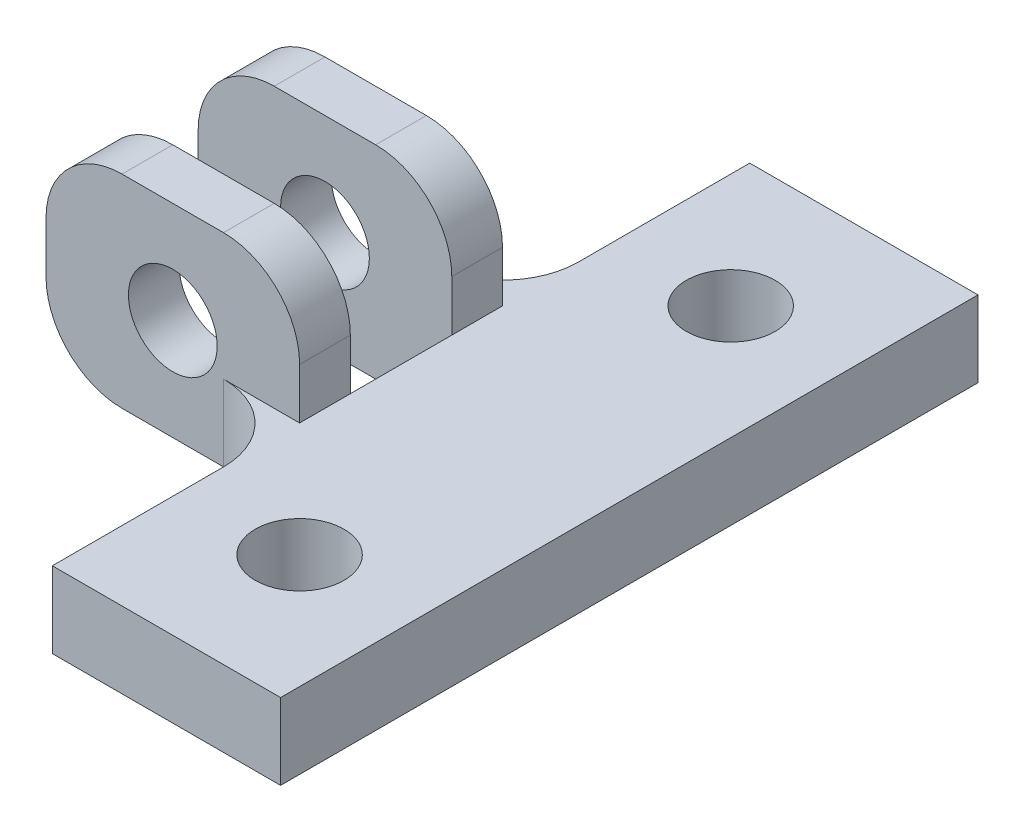
ISO-10303-21;
HEADER;
FILE_DESCRIPTION(('STEP AP214'),'2;1');
FILE_NAME('part.step','',(''),(''),'','','');
FILE_SCHEMA(('AUTOMOTIVE_DESIGN { 1 0 10303 214 1 1 1 1 }'));
ENDSEC;
DATA;
#1=APPLICATION_CONTEXT('core data for automotive mechanical design processes');
#2=APPLICATION_PROTOCOL_DEFINITION('international standard','automotive_design',2000,#1);
#3=PRODUCT_CONTEXT('',#1,'mechanical');
#4=PRODUCT('Part','Part','',(#3));
#5=PRODUCT_RELATED_PRODUCT_CATEGORY('part','',(#4));
#6=PRODUCT_DEFINITION_FORMATION('','',#4);
#7=PRODUCT_DEFINITION_CONTEXT('part definition',#1,'design');
#8=PRODUCT_DEFINITION('design','',#6,#7);
#9=PRODUCT_DEFINITION_SHAPE('','',#8);
#10=(LENGTH_UNIT() NAMED_UNIT(*) SI_UNIT(.MILLI.,.METRE.));
#11=(NAMED_UNIT(*) PLANE_ANGLE_UNIT() SI_UNIT($,.RADIAN.));
#12=(NAMED_UNIT(*) SI_UNIT($,.STERADIAN.) SOLID_ANGLE_UNIT());
#13=UNCERTAINTY_MEASURE_WITH_UNIT(LENGTH_MEASURE(1.E-05),#10,'distance_accuracy_value','');
#14=(GEOMETRIC_REPRESENTATION_CONTEXT(3) GLOBAL_UNCERTAINTY_ASSIGNED_CONTEXT((#13)) GLOBAL_UNIT_ASSIGNED_CONTEXT((#10,
#11,#12)) REPRESENTATION_CONTEXT('',''));
#15=CARTESIAN_POINT('',(0.,0.,0.));
#16=DIRECTION('',(0.,0.,1.));
#17=DIRECTION('',(1.,0.,0.));
#18=AXIS2_PLACEMENT_3D('',#15,#16,#17);
#19=CARTESIAN_POINT('',(-24.,3.,-13.75));
#20=DIRECTION('',(1.,0.,0.));
#21=DIRECTION('',(0.,0.,-1.));
#22=AXIS2_PLACEMENT_3D('',#19,#20,#21);
#23=PLANE('',#22);
#24=DIRECTION('',(0.,1.,0.));
#25=VECTOR('',#24,1.);
#26=CARTESIAN_POINT('',(-24.,3.,-2.));
#27=LINE('',#26,#25);
#28=CARTESIAN_POINT('',(-24.,0.,-2.));
#29=VERTEX_POINT('',#28);
#30=CARTESIAN_POINT('',(-24.,3.,-2.));
#31=VERTEX_POINT('',#30);
#32=EDGE_CURVE('E215',#29,#31,#27,.T.);
#33=ORIENTED_EDGE('',*,*,#32,.F.);
#34=DIRECTION('',(0.,0.,1.));
#35=VECTOR('',#34,1.);
#36=CARTESIAN_POINT('',(-24.,0.,-13.75));
#37=LINE('',#36,#35);
#38=CARTESIAN_POINT('',(-24.,0.,2.));
#39=VERTEX_POINT('',#38);
#40=EDGE_CURVE('E275',#29,#39,#37,.T.);
#41=ORIENTED_EDGE('',*,*,#40,.T.);
#42=DIRECTION('',(0.,-1.,0.));
#43=VECTOR('',#42,1.);
#44=CARTESIAN_POINT('',(-24.,3.,2.));
#45=LINE('',#44,#43);
#46=CARTESIAN_POINT('',(-24.,3.,2.));
#47=VERTEX_POINT('',#46);
#48=EDGE_CURVE('E217',#47,#39,#45,.T.);
#49=ORIENTED_EDGE('',*,*,#48,.F.);
#50=DIRECTION('',(0.,0.,1.));
#51=VECTOR('',#50,1.);
#52=CARTESIAN_POINT('',(-24.,3.,-13.75));
#53=LINE('',#52,#51);
#54=EDGE_CURVE('E208',#31,#47,#53,.T.);
#55=ORIENTED_EDGE('',*,*,#54,.F.);
#56=EDGE_LOOP('',(#33,#41,#49,#55));
#57=FACE_BOUND('',#56,.T.);
#58=ADVANCED_FACE('F35',(#57),#23,.F.);
#59=CARTESIAN_POINT('',(-24.,0.,-13.75));
#60=VERTEX_POINT('',#59);
#61=CARTESIAN_POINT('',(-24.,0.,-7.));
#62=VERTEX_POINT('',#61);
#63=EDGE_CURVE('E272',#60,#62,#37,.T.);
#64=ORIENTED_EDGE('',*,*,#63,.T.);
#65=DIRECTION('',(0.,-1.,0.));
#66=VECTOR('',#65,1.);
#67=CARTESIAN_POINT('',(-24.,3.,-7.));
#68=LINE('',#67,#66);
#69=CARTESIAN_POINT('',(-24.,3.,-7.));
#70=VERTEX_POINT('',#69);
#71=EDGE_CURVE('E57',#62,#70,#68,.F.);
#72=ORIENTED_EDGE('',*,*,#71,.T.);
#73=CARTESIAN_POINT('',(-24.,3.,-13.75));
#74=VERTEX_POINT('',#73);
#75=EDGE_CURVE('E218',#74,#70,#53,.T.);
#76=ORIENTED_EDGE('',*,*,#75,.F.);
#77=DIRECTION('',(0.,-1.,0.));
#78=VECTOR('',#77,1.);
#79=CARTESIAN_POINT('',(-24.,3.,-13.75));
#80=LINE('',#79,#78);
#81=EDGE_CURVE('E271',#74,#60,#80,.T.);
#82=ORIENTED_EDGE('',*,*,#81,.T.);
#83=EDGE_LOOP('',(#64,#72,#76,#82));
#84=FACE_BOUND('',#83,.T.);
#85=ADVANCED_FACE('F371',(#84),#23,.F.);
#86=CARTESIAN_POINT('',(-24.,3.,7.));
#87=VERTEX_POINT('',#86);
#88=CARTESIAN_POINT('',(-24.,3.,13.75));
#89=VERTEX_POINT('',#88);
#90=EDGE_CURVE('E219',#87,#89,#53,.T.);
#91=ORIENTED_EDGE('',*,*,#90,.F.);
#92=DIRECTION('',(0.,1.,0.));
#93=VECTOR('',#92,1.);
#94=CARTESIAN_POINT('',(-24.,0.,7.));
#95=LINE('',#94,#93);
#96=CARTESIAN_POINT('',(-24.,0.,7.));
#97=VERTEX_POINT('',#96);
#98=EDGE_CURVE('E357',#87,#97,#95,.F.);
#99=ORIENTED_EDGE('',*,*,#98,.T.);
#100=CARTESIAN_POINT('',(-24.,0.,13.75));
#101=VERTEX_POINT('',#100);
#102=EDGE_CURVE('E262',#97,#101,#37,.T.);
#103=ORIENTED_EDGE('',*,*,#102,.T.);
#104=DIRECTION('',(0.,-1.,0.));
#105=VECTOR('',#104,1.);
#106=CARTESIAN_POINT('',(-24.,3.,13.75));
#107=LINE('',#106,#105);
#108=EDGE_CURVE('E289',#89,#101,#107,.T.);
#109=ORIENTED_EDGE('',*,*,#108,.F.);
#110=EDGE_LOOP('',(#91,#99,#103,#109));
#111=FACE_BOUND('',#110,.T.);
#112=ADVANCED_FACE('F413',(#111),#23,.F.);
#113=CARTESIAN_POINT('',(0.,3.,0.));
#114=DIRECTION('',(0.,1.,0.));
#115=DIRECTION('',(0.,0.,1.));
#116=AXIS2_PLACEMENT_3D('',#113,#114,#115);
#117=PLANE('',#116);
#118=DIRECTION('',(0.,0.,-1.));
#119=VECTOR('',#118,1.);
#120=CARTESIAN_POINT('',(-24.,3.,0.));
#121=LINE('',#120,#119);
#122=CARTESIAN_POINT('',(-24.,3.,-4.));
#123=VERTEX_POINT('',#122);
#124=EDGE_CURVE('E196',#31,#123,#121,.T.);
#125=ORIENTED_EDGE('',*,*,#124,.F.);
#126=ORIENTED_EDGE('',*,*,#54,.T.);
#127=DIRECTION('',(0.,0.,-1.));
#128=VECTOR('',#127,1.);
#129=CARTESIAN_POINT('',(-24.,3.,0.));
#130=LINE('',#129,#128);
#131=CARTESIAN_POINT('',(-24.,3.,4.));
#132=VERTEX_POINT('',#131);
#133=EDGE_CURVE('E226',#132,#47,#130,.T.);
#134=ORIENTED_EDGE('',*,*,#133,.F.);
#135=DIRECTION('',(1.,0.,0.));
#136=VECTOR('',#135,1.);
#137=CARTESIAN_POINT('',(-34.,3.,4.));
#138=LINE('',#137,#136);
#139=CARTESIAN_POINT('',(-27.,3.,4.));
#140=VERTEX_POINT('',#139);
#141=EDGE_CURVE('E299',#140,#132,#138,.T.);
#142=ORIENTED_EDGE('',*,*,#141,.F.);
#143=CARTESIAN_POINT('',(-27.,3.,7.));
#144=DIRECTION('',(0.,1.,0.));
#145=DIRECTION('',(0.,0.,1.));
#146=AXIS2_PLACEMENT_3D('',#143,#144,#145);
#147=CIRCLE('',#146,3.);
#148=EDGE_CURVE('E360',#140,#87,#147,.F.);
#149=ORIENTED_EDGE('',*,*,#148,.T.);
#150=ORIENTED_EDGE('',*,*,#90,.T.);
#151=DIRECTION('',(1.,0.,0.));
#152=VECTOR('',#151,1.);
#153=CARTESIAN_POINT('',(-24.,3.,13.75));
#154=LINE('',#153,#152);
#155=CARTESIAN_POINT('',(-15.,3.,13.75));
#156=VERTEX_POINT('',#155);
#157=EDGE_CURVE('E265',#89,#156,#154,.T.);
#158=ORIENTED_EDGE('',*,*,#157,.T.);
#159=DIRECTION('',(0.,0.,-1.));
#160=VECTOR('',#159,1.);
#161=CARTESIAN_POINT('',(-15.,3.,-13.75));
#162=LINE('',#161,#160);
#163=CARTESIAN_POINT('',(-15.,3.,-13.75));
#164=VERTEX_POINT('',#163);
#165=EDGE_CURVE('E267',#156,#164,#162,.T.);
#166=ORIENTED_EDGE('',*,*,#165,.T.);
#167=DIRECTION('',(-1.,0.,0.));
#168=VECTOR('',#167,1.);
#169=CARTESIAN_POINT('',(-24.,3.,-13.75));
#170=LINE('',#169,#168);
#171=EDGE_CURVE('E269',#164,#74,#170,.T.);
#172=ORIENTED_EDGE('',*,*,#171,.T.);
#173=ORIENTED_EDGE('',*,*,#75,.T.);
#174=CARTESIAN_POINT('',(-27.,3.,-7.));
#175=DIRECTION('',(0.,1.,0.));
#176=DIRECTION('',(0.,0.,1.));
#177=AXIS2_PLACEMENT_3D('',#174,#175,#176);
#178=CIRCLE('',#177,3.);
#179=CARTESIAN_POINT('',(-27.,3.,-4.));
#180=VERTEX_POINT('',#179);
#181=EDGE_CURVE('E11',#70,#180,#178,.F.);
#182=ORIENTED_EDGE('',*,*,#181,.T.);
#183=DIRECTION('',(-1.,0.,0.));
#184=VECTOR('',#183,1.);
#185=CARTESIAN_POINT('',(-34.,3.,-4.));
#186=LINE('',#185,#184);
#187=EDGE_CURVE('E49',#123,#180,#186,.T.);
#188=ORIENTED_EDGE('',*,*,#187,.F.);
#189=EDGE_LOOP('',(#125,#126,#134,#142,#149,#150,#158,#166,#172,#173,#182,#188));
#190=FACE_BOUND('',#189,.T.);
#191=CARTESIAN_POINT('',(-19.5,3.,-8.5));
#192=DIRECTION('',(0.,1.,0.));
#193=DIRECTION('',(0.,0.,1.));
#194=AXIS2_PLACEMENT_3D('',#191,#192,#193);
#195=CIRCLE('',#194,1.75);
#196=CARTESIAN_POINT('',(-19.5,3.,-6.75));
#197=VERTEX_POINT('',#196);
#198=EDGE_CURVE('E259',#197,#197,#195,.T.);
#199=ORIENTED_EDGE('',*,*,#198,.F.);
#200=EDGE_LOOP('',(#199));
#201=FACE_BOUND('',#200,.T.);
#202=CARTESIAN_POINT('',(-19.5,3.,8.5));
#203=DIRECTION('',(0.,1.,0.));
#204=DIRECTION('',(0.,0.,1.));
#205=AXIS2_PLACEMENT_3D('',#202,#203,#204);
#206=CIRCLE('',#205,1.75);
#207=CARTESIAN_POINT('',(-19.5,3.,10.25));
#208=VERTEX_POINT('',#207);
#209=EDGE_CURVE('E253',#208,#208,#206,.T.);
#210=ORIENTED_EDGE('',*,*,#209,.F.);
#211=EDGE_LOOP('',(#210));
#212=FACE_BOUND('',#211,.T.);
#213=ADVANCED_FACE('F205',(#190,#201,#212),#117,.T.);
#214=CARTESIAN_POINT('',(0.,0.,0.));
#215=DIRECTION('',(0.,1.,0.));
#216=DIRECTION('',(0.,0.,1.));
#217=AXIS2_PLACEMENT_3D('',#214,#215,#216);
#218=PLANE('',#217);
#219=DIRECTION('',(1.,0.,0.));
#220=VECTOR('',#219,1.);
#221=CARTESIAN_POINT('',(-34.,0.,-2.));
#222=LINE('',#221,#220);
#223=CARTESIAN_POINT('',(-31.,0.,-2.));
#224=VERTEX_POINT('',#223);
#225=EDGE_CURVE('E223',#224,#29,#222,.T.);
#226=ORIENTED_EDGE('',*,*,#225,.F.);
#227=DIRECTION('',(0.,0.,1.));
#228=VECTOR('',#227,1.);
#229=CARTESIAN_POINT('',(-31.,0.,0.));
#230=LINE('',#229,#228);
#231=CARTESIAN_POINT('',(-31.,0.,-4.));
#232=VERTEX_POINT('',#231);
#233=EDGE_CURVE('E355',#224,#232,#230,.F.);
#234=ORIENTED_EDGE('',*,*,#233,.T.);
#235=DIRECTION('',(1.,0.,0.));
#236=VECTOR('',#235,1.);
#237=CARTESIAN_POINT('',(-34.,0.,-4.));
#238=LINE('',#237,#236);
#239=CARTESIAN_POINT('',(-27.,0.,-4.));
#240=VERTEX_POINT('',#239);
#241=EDGE_CURVE('E237',#232,#240,#238,.T.);
#242=ORIENTED_EDGE('',*,*,#241,.T.);
#243=CARTESIAN_POINT('',(-27.,0.,-7.));
#244=DIRECTION('',(0.,1.,0.));
#245=DIRECTION('',(0.,0.,1.));
#246=AXIS2_PLACEMENT_3D('',#243,#244,#245);
#247=CIRCLE('',#246,3.);
#248=EDGE_CURVE('E43',#240,#62,#247,.T.);
#249=ORIENTED_EDGE('',*,*,#248,.T.);
#250=ORIENTED_EDGE('',*,*,#63,.F.);
#251=DIRECTION('',(-1.,0.,0.));
#252=VECTOR('',#251,1.);
#253=CARTESIAN_POINT('',(-24.,0.,-13.75));
#254=LINE('',#253,#252);
#255=CARTESIAN_POINT('',(-15.,0.,-13.75));
#256=VERTEX_POINT('',#255);
#257=EDGE_CURVE('E279',#256,#60,#254,.T.);
#258=ORIENTED_EDGE('',*,*,#257,.F.);
#259=DIRECTION('',(0.,0.,-1.));
#260=VECTOR('',#259,1.);
#261=CARTESIAN_POINT('',(-15.,0.,-13.75));
#262=LINE('',#261,#260);
#263=CARTESIAN_POINT('',(-15.,0.,13.75));
#264=VERTEX_POINT('',#263);
#265=EDGE_CURVE('E277',#264,#256,#262,.T.);
#266=ORIENTED_EDGE('',*,*,#265,.F.);
#267=DIRECTION('',(1.,0.,0.));
#268=VECTOR('',#267,1.);
#269=CARTESIAN_POINT('',(-24.,0.,13.75));
#270=LINE('',#269,#268);
#271=EDGE_CURVE('E274',#101,#264,#270,.T.);
#272=ORIENTED_EDGE('',*,*,#271,.F.);
#273=ORIENTED_EDGE('',*,*,#102,.F.);
#274=CARTESIAN_POINT('',(-27.,0.,7.));
#275=DIRECTION('',(0.,1.,0.));
#276=DIRECTION('',(0.,0.,1.));
#277=AXIS2_PLACEMENT_3D('',#274,#275,#276);
#278=CIRCLE('',#277,3.);
#279=CARTESIAN_POINT('',(-27.,0.,4.));
#280=VERTEX_POINT('',#279);
#281=EDGE_CURVE('E362',#97,#280,#278,.T.);
#282=ORIENTED_EDGE('',*,*,#281,.T.);
#283=DIRECTION('',(1.,0.,0.));
#284=VECTOR('',#283,1.);
#285=CARTESIAN_POINT('',(-34.,0.,4.));
#286=LINE('',#285,#284);
#287=CARTESIAN_POINT('',(-31.,0.,4.));
#288=VERTEX_POINT('',#287);
#289=EDGE_CURVE('E249',#288,#280,#286,.T.);
#290=ORIENTED_EDGE('',*,*,#289,.F.);
#291=DIRECTION('',(0.,0.,1.));
#292=VECTOR('',#291,1.);
#293=CARTESIAN_POINT('',(-31.,0.,0.));
#294=LINE('',#293,#292);
#295=CARTESIAN_POINT('',(-31.,0.,2.));
#296=VERTEX_POINT('',#295);
#297=EDGE_CURVE('E353',#288,#296,#294,.F.);
#298=ORIENTED_EDGE('',*,*,#297,.T.);
#299=DIRECTION('',(1.,0.,0.));
#300=VECTOR('',#299,1.);
#301=CARTESIAN_POINT('',(-34.,0.,2.));
#302=LINE('',#301,#300);
#303=EDGE_CURVE('E246',#296,#39,#302,.T.);
#304=ORIENTED_EDGE('',*,*,#303,.T.);
#305=ORIENTED_EDGE('',*,*,#40,.F.);
#306=EDGE_LOOP('',(#226,#234,#242,#249,#250,#258,#266,#272,#273,#282,#290,#298,#304,#305));
#307=FACE_BOUND('',#306,.T.);
#308=CARTESIAN_POINT('',(-19.5,0.,-8.5));
#309=DIRECTION('',(0.,1.,0.));
#310=DIRECTION('',(0.,0.,1.));
#311=AXIS2_PLACEMENT_3D('',#308,#309,#310);
#312=CIRCLE('',#311,1.75);
#313=CARTESIAN_POINT('',(-19.5,0.,-6.75));
#314=VERTEX_POINT('',#313);
#315=EDGE_CURVE('E256',#314,#314,#312,.T.);
#316=ORIENTED_EDGE('',*,*,#315,.T.);
#317=EDGE_LOOP('',(#316));
#318=FACE_BOUND('',#317,.T.);
#319=CARTESIAN_POINT('',(-19.5,0.,8.5));
#320=DIRECTION('',(0.,1.,0.));
#321=DIRECTION('',(0.,0.,1.));
#322=AXIS2_PLACEMENT_3D('',#319,#320,#321);
#323=CIRCLE('',#322,1.75);
#324=CARTESIAN_POINT('',(-19.5,0.,10.25));
#325=VERTEX_POINT('',#324);
#326=EDGE_CURVE('E252',#325,#325,#323,.T.);
#327=ORIENTED_EDGE('',*,*,#326,.T.);
#328=EDGE_LOOP('',(#327));
#329=FACE_BOUND('',#328,.T.);
#330=ADVANCED_FACE('F365',(#307,#318,#329),#218,.F.);
#331=CARTESIAN_POINT('',(-24.,3.,13.75));
#332=DIRECTION('',(0.,0.,-1.));
#333=DIRECTION('',(-1.,0.,0.));
#334=AXIS2_PLACEMENT_3D('',#331,#332,#333);
#335=PLANE('',#334);
#336=ORIENTED_EDGE('',*,*,#271,.T.);
#337=DIRECTION('',(0.,-1.,0.));
#338=VECTOR('',#337,1.);
#339=CARTESIAN_POINT('',(-15.,3.,13.75));
#340=LINE('',#339,#338);
#341=EDGE_CURVE('E286',#156,#264,#340,.T.);
#342=ORIENTED_EDGE('',*,*,#341,.F.);
#343=ORIENTED_EDGE('',*,*,#157,.F.);
#344=ORIENTED_EDGE('',*,*,#108,.T.);
#345=EDGE_LOOP('',(#336,#342,#343,#344));
#346=FACE_BOUND('',#345,.T.);
#347=ADVANCED_FACE('F468',(#346),#335,.F.);
#348=CARTESIAN_POINT('',(-15.,3.,-13.75));
#349=DIRECTION('',(-1.,0.,0.));
#350=DIRECTION('',(0.,0.,1.));
#351=AXIS2_PLACEMENT_3D('',#348,#349,#350);
#352=PLANE('',#351);
#353=ORIENTED_EDGE('',*,*,#265,.T.);
#354=DIRECTION('',(0.,-1.,0.));
#355=VECTOR('',#354,1.);
#356=CARTESIAN_POINT('',(-15.,3.,-13.75));
#357=LINE('',#356,#355);
#358=EDGE_CURVE('E283',#164,#256,#357,.T.);
#359=ORIENTED_EDGE('',*,*,#358,.F.);
#360=ORIENTED_EDGE('',*,*,#165,.F.);
#361=ORIENTED_EDGE('',*,*,#341,.T.);
#362=EDGE_LOOP('',(#353,#359,#360,#361));
#363=FACE_BOUND('',#362,.T.);
#364=ADVANCED_FACE('F477',(#363),#352,.F.);
#365=CARTESIAN_POINT('',(-24.,3.,-13.75));
#366=DIRECTION('',(0.,0.,1.));
#367=DIRECTION('',(1.,0.,0.));
#368=AXIS2_PLACEMENT_3D('',#365,#366,#367);
#369=PLANE('',#368);
#370=ORIENTED_EDGE('',*,*,#257,.T.);
#371=ORIENTED_EDGE('',*,*,#81,.F.);
#372=ORIENTED_EDGE('',*,*,#171,.F.);
#373=ORIENTED_EDGE('',*,*,#358,.T.);
#374=EDGE_LOOP('',(#370,#371,#372,#373));
#375=FACE_BOUND('',#374,.T.);
#376=ADVANCED_FACE('F474',(#375),#369,.F.);
#377=CARTESIAN_POINT('',(-19.5,3.,-8.5));
#378=DIRECTION('',(0.,-1.,0.));
#379=DIRECTION('',(0.,0.,-1.));
#380=AXIS2_PLACEMENT_3D('',#377,#378,#379);
#381=CYLINDRICAL_SURFACE('',#380,1.75);
#382=ORIENTED_EDGE('',*,*,#198,.T.);
#383=EDGE_LOOP('',(#382));
#384=FACE_BOUND('',#383,.T.);
#385=ORIENTED_EDGE('',*,*,#315,.F.);
#386=EDGE_LOOP('',(#385));
#387=FACE_BOUND('',#386,.T.);
#388=ADVANCED_FACE('F471',(#384,#387),#381,.F.);
#389=CARTESIAN_POINT('',(-19.5,3.,8.5));
#390=DIRECTION('',(0.,-1.,0.));
#391=DIRECTION('',(0.,0.,-1.));
#392=AXIS2_PLACEMENT_3D('',#389,#390,#391);
#393=CYLINDRICAL_SURFACE('',#392,1.75);
#394=ORIENTED_EDGE('',*,*,#209,.T.);
#395=EDGE_LOOP('',(#394));
#396=FACE_BOUND('',#395,.T.);
#397=ORIENTED_EDGE('',*,*,#326,.F.);
#398=EDGE_LOOP('',(#397));
#399=FACE_BOUND('',#398,.T.);
#400=ADVANCED_FACE('F504',(#396,#399),#393,.F.);
#401=CARTESIAN_POINT('',(-34.,3.,4.));
#402=DIRECTION('',(0.,0.,-1.));
#403=DIRECTION('',(0.,1.,0.));
#404=AXIS2_PLACEMENT_3D('',#401,#402,#403);
#405=PLANE('',#404);
#406=CARTESIAN_POINT('',(-29.,4.,4.));
#407=DIRECTION('',(0.,0.,-1.));
#408=DIRECTION('',(0.,1.,0.));
#409=AXIS2_PLACEMENT_3D('',#406,#407,#408);
#410=CIRCLE('',#409,1.75);
#411=CARTESIAN_POINT('',(-29.,5.75,4.));
#412=VERTEX_POINT('',#411);
#413=EDGE_CURVE('E720',#412,#412,#410,.T.);
#414=ORIENTED_EDGE('',*,*,#413,.T.);
#415=EDGE_LOOP('',(#414));
#416=FACE_BOUND('',#415,.T.);
#417=DIRECTION('',(0.,-1.,0.));
#418=VECTOR('',#417,1.);
#419=CARTESIAN_POINT('',(-24.,8.,4.));
#420=LINE('',#419,#418);
#421=CARTESIAN_POINT('',(-24.,5.,4.));
#422=VERTEX_POINT('',#421);
#423=EDGE_CURVE('E232',#422,#132,#420,.T.);
#424=ORIENTED_EDGE('',*,*,#423,.F.);
#425=CARTESIAN_POINT('',(-27.,5.,4.));
#426=DIRECTION('',(0.,0.,-1.));
#427=DIRECTION('',(0.,1.,0.));
#428=AXIS2_PLACEMENT_3D('',#425,#426,#427);
#429=CIRCLE('',#428,3.);
#430=CARTESIAN_POINT('',(-27.,8.,4.));
#431=VERTEX_POINT('',#430);
#432=EDGE_CURVE('E308',#422,#431,#429,.F.);
#433=ORIENTED_EDGE('',*,*,#432,.T.);
#434=DIRECTION('',(-1.,0.,0.));
#435=VECTOR('',#434,1.);
#436=CARTESIAN_POINT('',(-34.,8.,4.));
#437=LINE('',#436,#435);
#438=CARTESIAN_POINT('',(-31.,8.,4.));
#439=VERTEX_POINT('',#438);
#440=EDGE_CURVE('E386',#431,#439,#437,.T.);
#441=ORIENTED_EDGE('',*,*,#440,.T.);
#442=CARTESIAN_POINT('',(-31.,5.,4.));
#443=DIRECTION('',(0.,0.,-1.));
#444=DIRECTION('',(0.,1.,0.));
#445=AXIS2_PLACEMENT_3D('',#442,#443,#444);
#446=CIRCLE('',#445,3.);
#447=CARTESIAN_POINT('',(-34.,5.,4.));
#448=VERTEX_POINT('',#447);
#449=EDGE_CURVE('E306',#439,#448,#446,.F.);
#450=ORIENTED_EDGE('',*,*,#449,.T.);
#451=DIRECTION('',(0.,1.,0.));
#452=VECTOR('',#451,1.);
#453=CARTESIAN_POINT('',(-34.,3.,4.));
#454=LINE('',#453,#452);
#455=CARTESIAN_POINT('',(-34.,3.,4.));
#456=VERTEX_POINT('',#455);
#457=EDGE_CURVE('E240',#456,#448,#454,.T.);
#458=ORIENTED_EDGE('',*,*,#457,.F.);
#459=CARTESIAN_POINT('',(-31.,3.,4.));
#460=DIRECTION('',(0.,0.,-1.));
#461=DIRECTION('',(0.,1.,0.));
#462=AXIS2_PLACEMENT_3D('',#459,#460,#461);
#463=CIRCLE('',#462,3.);
#464=EDGE_CURVE('E304',#456,#288,#463,.F.);
#465=ORIENTED_EDGE('',*,*,#464,.T.);
#466=ORIENTED_EDGE('',*,*,#289,.T.);
#467=DIRECTION('',(0.,1.,0.));
#468=VECTOR('',#467,1.);
#469=CARTESIAN_POINT('',(-27.,3.,4.));
#470=LINE('',#469,#468);
#471=EDGE_CURVE('E301',#280,#140,#470,.T.);
#472=ORIENTED_EDGE('',*,*,#471,.T.);
#473=ORIENTED_EDGE('',*,*,#141,.T.);
#474=EDGE_LOOP('',(#424,#433,#441,#450,#458,#465,#466,#472,#473));
#475=FACE_BOUND('',#474,.T.);
#476=ADVANCED_FACE('F405',(#416,#475),#405,.F.);
#477=CARTESIAN_POINT('',(-34.,3.,2.));
#478=DIRECTION('',(0.,0.,1.));
#479=DIRECTION('',(1.,0.,0.));
#480=AXIS2_PLACEMENT_3D('',#477,#478,#479);
#481=PLANE('',#480);
#482=CARTESIAN_POINT('',(-29.,4.,2.));
#483=DIRECTION('',(0.,0.,1.));
#484=DIRECTION('',(1.,0.,0.));
#485=AXIS2_PLACEMENT_3D('',#482,#483,#484);
#486=CIRCLE('',#485,1.75);
#487=CARTESIAN_POINT('',(-27.25,4.,2.));
#488=VERTEX_POINT('',#487);
#489=EDGE_CURVE('E723',#488,#488,#486,.T.);
#490=ORIENTED_EDGE('',*,*,#489,.T.);
#491=EDGE_LOOP('',(#490));
#492=FACE_BOUND('',#491,.T.);
#493=DIRECTION('',(1.,0.,0.));
#494=VECTOR('',#493,1.);
#495=CARTESIAN_POINT('',(-34.,8.,2.));
#496=LINE('',#495,#494);
#497=CARTESIAN_POINT('',(-31.,8.,2.));
#498=VERTEX_POINT('',#497);
#499=CARTESIAN_POINT('',(-27.,8.,2.));
#500=VERTEX_POINT('',#499);
#501=EDGE_CURVE('E210',#498,#500,#496,.T.);
#502=ORIENTED_EDGE('',*,*,#501,.T.);
#503=CARTESIAN_POINT('',(-27.,5.,2.));
#504=DIRECTION('',(0.,0.,1.));
#505=DIRECTION('',(1.,0.,0.));
#506=AXIS2_PLACEMENT_3D('',#503,#504,#505);
#507=CIRCLE('',#506,3.);
#508=CARTESIAN_POINT('',(-24.,5.,2.));
#509=VERTEX_POINT('',#508);
#510=EDGE_CURVE('E318',#500,#509,#507,.F.);
#511=ORIENTED_EDGE('',*,*,#510,.T.);
#512=DIRECTION('',(0.,-1.,0.));
#513=VECTOR('',#512,1.);
#514=CARTESIAN_POINT('',(-24.,8.,2.));
#515=LINE('',#514,#513);
#516=EDGE_CURVE('E389',#509,#47,#515,.T.);
#517=ORIENTED_EDGE('',*,*,#516,.T.);
#518=ORIENTED_EDGE('',*,*,#48,.T.);
#519=ORIENTED_EDGE('',*,*,#303,.F.);
#520=CARTESIAN_POINT('',(-31.,3.,2.));
#521=DIRECTION('',(0.,0.,1.));
#522=DIRECTION('',(1.,0.,0.));
#523=AXIS2_PLACEMENT_3D('',#520,#521,#522);
#524=CIRCLE('',#523,3.);
#525=CARTESIAN_POINT('',(-34.,3.,2.));
#526=VERTEX_POINT('',#525);
#527=EDGE_CURVE('E314',#296,#526,#524,.F.);
#528=ORIENTED_EDGE('',*,*,#527,.T.);
#529=DIRECTION('',(0.,-1.,0.));
#530=VECTOR('',#529,1.);
#531=CARTESIAN_POINT('',(-34.,3.,2.));
#532=LINE('',#531,#530);
#533=CARTESIAN_POINT('',(-34.,5.,2.));
#534=VERTEX_POINT('',#533);
#535=EDGE_CURVE('E243',#534,#526,#532,.T.);
#536=ORIENTED_EDGE('',*,*,#535,.F.);
#537=CARTESIAN_POINT('',(-31.,5.,2.));
#538=DIRECTION('',(0.,0.,1.));
#539=DIRECTION('',(1.,0.,0.));
#540=AXIS2_PLACEMENT_3D('',#537,#538,#539);
#541=CIRCLE('',#540,3.);
#542=EDGE_CURVE('E316',#534,#498,#541,.F.);
#543=ORIENTED_EDGE('',*,*,#542,.T.);
#544=EDGE_LOOP('',(#502,#511,#517,#518,#519,#528,#536,#543));
#545=FACE_BOUND('',#544,.T.);
#546=ADVANCED_FACE('F394',(#492,#545),#481,.F.);
#547=CARTESIAN_POINT('',(-34.,0.,0.));
#548=DIRECTION('',(1.,0.,0.));
#549=DIRECTION('',(0.,0.,-1.));
#550=AXIS2_PLACEMENT_3D('',#547,#548,#549);
#551=PLANE('',#550);
#552=ORIENTED_EDGE('',*,*,#457,.T.);
#553=DIRECTION('',(0.,0.,-1.));
#554=VECTOR('',#553,1.);
#555=CARTESIAN_POINT('',(-34.,5.,0.));
#556=LINE('',#555,#554);
#557=EDGE_CURVE('E344',#448,#534,#556,.T.);
#558=ORIENTED_EDGE('',*,*,#557,.T.);
#559=ORIENTED_EDGE('',*,*,#535,.T.);
#560=DIRECTION('',(0.,0.,1.));
#561=VECTOR('',#560,1.);
#562=CARTESIAN_POINT('',(-34.,3.,0.));
#563=LINE('',#562,#561);
#564=EDGE_CURVE('E341',#526,#456,#563,.T.);
#565=ORIENTED_EDGE('',*,*,#564,.T.);
#566=EDGE_LOOP('',(#552,#558,#559,#565));
#567=FACE_BOUND('',#566,.T.);
#568=ADVANCED_FACE('F426',(#567),#551,.F.);
#569=CARTESIAN_POINT('',(-34.,3.,-2.));
#570=DIRECTION('',(0.,0.,-1.));
#571=DIRECTION('',(-1.,0.,0.));
#572=AXIS2_PLACEMENT_3D('',#569,#570,#571);
#573=PLANE('',#572);
#574=CARTESIAN_POINT('',(-29.,4.,-2.));
#575=DIRECTION('',(0.,0.,-1.));
#576=DIRECTION('',(-1.,0.,0.));
#577=AXIS2_PLACEMENT_3D('',#574,#575,#576);
#578=CIRCLE('',#577,1.75);
#579=CARTESIAN_POINT('',(-30.75,4.,-2.));
#580=VERTEX_POINT('',#579);
#581=EDGE_CURVE('E296',#580,#580,#578,.T.);
#582=ORIENTED_EDGE('',*,*,#581,.T.);
#583=EDGE_LOOP('',(#582));
#584=FACE_BOUND('',#583,.T.);
#585=DIRECTION('',(0.,-1.,0.));
#586=VECTOR('',#585,1.);
#587=CARTESIAN_POINT('',(-24.,8.,-2.));
#588=LINE('',#587,#586);
#589=CARTESIAN_POINT('',(-24.,5.,-2.));
#590=VERTEX_POINT('',#589);
#591=EDGE_CURVE('E193',#590,#31,#588,.T.);
#592=ORIENTED_EDGE('',*,*,#591,.F.);
#593=CARTESIAN_POINT('',(-27.,5.,-2.));
#594=DIRECTION('',(0.,0.,-1.));
#595=DIRECTION('',(-1.,0.,0.));
#596=AXIS2_PLACEMENT_3D('',#593,#594,#595);
#597=CIRCLE('',#596,3.);
#598=CARTESIAN_POINT('',(-27.,8.,-2.));
#599=VERTEX_POINT('',#598);
#600=EDGE_CURVE('E325',#590,#599,#597,.F.);
#601=ORIENTED_EDGE('',*,*,#600,.T.);
#602=DIRECTION('',(-1.,0.,0.));
#603=VECTOR('',#602,1.);
#604=CARTESIAN_POINT('',(-34.,8.,-2.));
#605=LINE('',#604,#603);
#606=CARTESIAN_POINT('',(-31.,8.,-2.));
#607=VERTEX_POINT('',#606);
#608=EDGE_CURVE('E378',#599,#607,#605,.T.);
#609=ORIENTED_EDGE('',*,*,#608,.T.);
#610=CARTESIAN_POINT('',(-31.,5.,-2.));
#611=DIRECTION('',(0.,0.,-1.));
#612=DIRECTION('',(-1.,0.,0.));
#613=AXIS2_PLACEMENT_3D('',#610,#611,#612);
#614=CIRCLE('',#613,3.);
#615=CARTESIAN_POINT('',(-34.,5.,-2.));
#616=VERTEX_POINT('',#615);
#617=EDGE_CURVE('E323',#607,#616,#614,.F.);
#618=ORIENTED_EDGE('',*,*,#617,.T.);
#619=DIRECTION('',(0.,1.,0.));
#620=VECTOR('',#619,1.);
#621=CARTESIAN_POINT('',(-34.,3.,-2.));
#622=LINE('',#621,#620);
#623=CARTESIAN_POINT('',(-34.,3.,-2.));
#624=VERTEX_POINT('',#623);
#625=EDGE_CURVE('E225',#624,#616,#622,.T.);
#626=ORIENTED_EDGE('',*,*,#625,.F.);
#627=CARTESIAN_POINT('',(-31.,3.,-2.));
#628=DIRECTION('',(0.,0.,-1.));
#629=DIRECTION('',(-1.,0.,0.));
#630=AXIS2_PLACEMENT_3D('',#627,#628,#629);
#631=CIRCLE('',#630,3.);
#632=EDGE_CURVE('E321',#624,#224,#631,.F.);
#633=ORIENTED_EDGE('',*,*,#632,.T.);
#634=ORIENTED_EDGE('',*,*,#225,.T.);
#635=ORIENTED_EDGE('',*,*,#32,.T.);
#636=EDGE_LOOP('',(#592,#601,#609,#618,#626,#633,#634,#635));
#637=FACE_BOUND('',#636,.T.);
#638=ADVANCED_FACE('F221',(#584,#637),#573,.F.);
#639=CARTESIAN_POINT('',(-34.,3.,-4.));
#640=DIRECTION('',(0.,0.,1.));
#641=DIRECTION('',(1.,0.,0.));
#642=AXIS2_PLACEMENT_3D('',#639,#640,#641);
#643=PLANE('',#642);
#644=CARTESIAN_POINT('',(-29.,4.,-4.));
#645=DIRECTION('',(0.,0.,1.));
#646=DIRECTION('',(1.,0.,0.));
#647=AXIS2_PLACEMENT_3D('',#644,#645,#646);
#648=CIRCLE('',#647,1.75);
#649=CARTESIAN_POINT('',(-27.25,4.,-4.));
#650=VERTEX_POINT('',#649);
#651=EDGE_CURVE('E293',#650,#650,#648,.T.);
#652=ORIENTED_EDGE('',*,*,#651,.T.);
#653=EDGE_LOOP('',(#652));
#654=FACE_BOUND('',#653,.T.);
#655=DIRECTION('',(1.,0.,0.));
#656=VECTOR('',#655,1.);
#657=CARTESIAN_POINT('',(-34.,8.,-4.));
#658=LINE('',#657,#656);
#659=CARTESIAN_POINT('',(-31.,8.,-4.));
#660=VERTEX_POINT('',#659);
#661=CARTESIAN_POINT('',(-27.,8.,-4.));
#662=VERTEX_POINT('',#661);
#663=EDGE_CURVE('E381',#660,#662,#658,.T.);
#664=ORIENTED_EDGE('',*,*,#663,.T.);
#665=CARTESIAN_POINT('',(-27.,5.,-4.));
#666=DIRECTION('',(0.,0.,1.));
#667=DIRECTION('',(1.,0.,0.));
#668=AXIS2_PLACEMENT_3D('',#665,#666,#667);
#669=CIRCLE('',#668,3.);
#670=CARTESIAN_POINT('',(-24.,5.,-4.));
#671=VERTEX_POINT('',#670);
#672=EDGE_CURVE('E339',#662,#671,#669,.F.);
#673=ORIENTED_EDGE('',*,*,#672,.T.);
#674=DIRECTION('',(0.,-1.,0.));
#675=VECTOR('',#674,1.);
#676=CARTESIAN_POINT('',(-24.,8.,-4.));
#677=LINE('',#676,#675);
#678=EDGE_CURVE('E201',#671,#123,#677,.T.);
#679=ORIENTED_EDGE('',*,*,#678,.T.);
#680=ORIENTED_EDGE('',*,*,#187,.T.);
#681=DIRECTION('',(0.,-1.,0.));
#682=VECTOR('',#681,1.);
#683=CARTESIAN_POINT('',(-27.,0.,-4.));
#684=LINE('',#683,#682);
#685=EDGE_CURVE('E332',#180,#240,#684,.T.);
#686=ORIENTED_EDGE('',*,*,#685,.T.);
#687=ORIENTED_EDGE('',*,*,#241,.F.);
#688=CARTESIAN_POINT('',(-31.,3.,-4.));
#689=DIRECTION('',(0.,0.,1.));
#690=DIRECTION('',(1.,0.,0.));
#691=AXIS2_PLACEMENT_3D('',#688,#689,#690);
#692=CIRCLE('',#691,3.);
#693=CARTESIAN_POINT('',(-34.,3.,-4.));
#694=VERTEX_POINT('',#693);
#695=EDGE_CURVE('E335',#232,#694,#692,.F.);
#696=ORIENTED_EDGE('',*,*,#695,.T.);
#697=DIRECTION('',(0.,-1.,0.));
#698=VECTOR('',#697,1.);
#699=CARTESIAN_POINT('',(-34.,3.,-4.));
#700=LINE('',#699,#698);
#701=CARTESIAN_POINT('',(-34.,5.,-4.));
#702=VERTEX_POINT('',#701);
#703=EDGE_CURVE('E229',#702,#694,#700,.T.);
#704=ORIENTED_EDGE('',*,*,#703,.F.);
#705=CARTESIAN_POINT('',(-31.,5.,-4.));
#706=DIRECTION('',(0.,0.,1.));
#707=DIRECTION('',(1.,0.,0.));
#708=AXIS2_PLACEMENT_3D('',#705,#706,#707);
#709=CIRCLE('',#708,3.);
#710=EDGE_CURVE('E337',#702,#660,#709,.F.);
#711=ORIENTED_EDGE('',*,*,#710,.T.);
#712=EDGE_LOOP('',(#664,#673,#679,#680,#686,#687,#696,#704,#711));
#713=FACE_BOUND('',#712,.T.);
#714=ADVANCED_FACE('F376',(#654,#713),#643,.F.);
#715=CARTESIAN_POINT('',(-34.,0.,0.));
#716=DIRECTION('',(1.,0.,0.));
#717=DIRECTION('',(0.,0.,-1.));
#718=AXIS2_PLACEMENT_3D('',#715,#716,#717);
#719=PLANE('',#718);
#720=ORIENTED_EDGE('',*,*,#625,.T.);
#721=DIRECTION('',(0.,0.,-1.));
#722=VECTOR('',#721,1.);
#723=CARTESIAN_POINT('',(-34.,5.,0.));
#724=LINE('',#723,#722);
#725=EDGE_CURVE('E350',#616,#702,#724,.T.);
#726=ORIENTED_EDGE('',*,*,#725,.T.);
#727=ORIENTED_EDGE('',*,*,#703,.T.);
#728=DIRECTION('',(0.,0.,1.));
#729=VECTOR('',#728,1.);
#730=CARTESIAN_POINT('',(-34.,3.,0.));
#731=LINE('',#730,#729);
#732=EDGE_CURVE('E347',#694,#624,#731,.T.);
#733=ORIENTED_EDGE('',*,*,#732,.T.);
#734=EDGE_LOOP('',(#720,#726,#727,#733));
#735=FACE_BOUND('',#734,.T.);
#736=ADVANCED_FACE('F593',(#735),#719,.F.);
#737=CARTESIAN_POINT('',(-24.,8.,4.));
#738=DIRECTION('',(1.,0.,0.));
#739=DIRECTION('',(0.,0.,-1.));
#740=AXIS2_PLACEMENT_3D('',#737,#738,#739);
#741=PLANE('',#740);
#742=ORIENTED_EDGE('',*,*,#516,.F.);
#743=DIRECTION('',(0.,0.,1.));
#744=VECTOR('',#743,1.);
#745=CARTESIAN_POINT('',(-24.,5.,4.));
#746=LINE('',#745,#744);
#747=EDGE_CURVE('E292',#509,#422,#746,.T.);
#748=ORIENTED_EDGE('',*,*,#747,.T.);
#749=ORIENTED_EDGE('',*,*,#423,.T.);
#750=ORIENTED_EDGE('',*,*,#133,.T.);
#751=EDGE_LOOP('',(#742,#748,#749,#750));
#752=FACE_BOUND('',#751,.T.);
#753=ADVANCED_FACE('F399',(#752),#741,.T.);
#754=CARTESIAN_POINT('',(0.,8.,0.));
#755=DIRECTION('',(0.,-1.,0.));
#756=DIRECTION('',(0.,0.,-1.));
#757=AXIS2_PLACEMENT_3D('',#754,#755,#756);
#758=PLANE('',#757);
#759=ORIENTED_EDGE('',*,*,#440,.F.);
#760=DIRECTION('',(0.,0.,1.));
#761=VECTOR('',#760,1.);
#762=CARTESIAN_POINT('',(-27.,8.,2.));
#763=LINE('',#762,#761);
#764=EDGE_CURVE('E312',#431,#500,#763,.F.);
#765=ORIENTED_EDGE('',*,*,#764,.T.);
#766=ORIENTED_EDGE('',*,*,#501,.F.);
#767=DIRECTION('',(0.,0.,-1.));
#768=VECTOR('',#767,1.);
#769=CARTESIAN_POINT('',(-31.,8.,0.));
#770=LINE('',#769,#768);
#771=EDGE_CURVE('E310',#498,#439,#770,.F.);
#772=ORIENTED_EDGE('',*,*,#771,.T.);
#773=EDGE_LOOP('',(#759,#765,#766,#772));
#774=FACE_BOUND('',#773,.T.);
#775=ADVANCED_FACE('F435',(#774),#758,.F.);
#776=CARTESIAN_POINT('',(-24.,8.,-2.));
#777=DIRECTION('',(1.,0.,0.));
#778=DIRECTION('',(0.,0.,-1.));
#779=AXIS2_PLACEMENT_3D('',#776,#777,#778);
#780=PLANE('',#779);
#781=ORIENTED_EDGE('',*,*,#678,.F.);
#782=DIRECTION('',(0.,0.,1.));
#783=VECTOR('',#782,1.);
#784=CARTESIAN_POINT('',(-24.,5.,-2.));
#785=LINE('',#784,#783);
#786=EDGE_CURVE('E198',#671,#590,#785,.T.);
#787=ORIENTED_EDGE('',*,*,#786,.T.);
#788=ORIENTED_EDGE('',*,*,#591,.T.);
#789=ORIENTED_EDGE('',*,*,#124,.T.);
#790=EDGE_LOOP('',(#781,#787,#788,#789));
#791=FACE_BOUND('',#790,.T.);
#792=ADVANCED_FACE('F195',(#791),#780,.T.);
#793=CARTESIAN_POINT('',(0.,8.,0.));
#794=DIRECTION('',(0.,-1.,0.));
#795=DIRECTION('',(0.,0.,-1.));
#796=AXIS2_PLACEMENT_3D('',#793,#794,#795);
#797=PLANE('',#796);
#798=ORIENTED_EDGE('',*,*,#608,.F.);
#799=DIRECTION('',(0.,0.,1.));
#800=VECTOR('',#799,1.);
#801=CARTESIAN_POINT('',(-27.,8.,-4.));
#802=LINE('',#801,#800);
#803=EDGE_CURVE('E329',#599,#662,#802,.F.);
#804=ORIENTED_EDGE('',*,*,#803,.T.);
#805=ORIENTED_EDGE('',*,*,#663,.F.);
#806=DIRECTION('',(0.,0.,-1.));
#807=VECTOR('',#806,1.);
#808=CARTESIAN_POINT('',(-31.,8.,0.));
#809=LINE('',#808,#807);
#810=EDGE_CURVE('E327',#660,#607,#809,.F.);
#811=ORIENTED_EDGE('',*,*,#810,.T.);
#812=EDGE_LOOP('',(#798,#804,#805,#811));
#813=FACE_BOUND('',#812,.T.);
#814=ADVANCED_FACE('F629',(#813),#797,.F.);
#815=CARTESIAN_POINT('',(-29.,4.,13.75));
#816=DIRECTION('',(0.,0.,-1.));
#817=DIRECTION('',(0.,1.,0.));
#818=AXIS2_PLACEMENT_3D('',#815,#816,#817);
#819=CYLINDRICAL_SURFACE('',#818,1.75);
#820=ORIENTED_EDGE('',*,*,#651,.F.);
#821=EDGE_LOOP('',(#820));
#822=FACE_BOUND('',#821,.T.);
#823=ORIENTED_EDGE('',*,*,#581,.F.);
#824=EDGE_LOOP('',(#823));
#825=FACE_BOUND('',#824,.T.);
#826=ADVANCED_FACE('F449',(#822,#825),#819,.F.);
#827=ORIENTED_EDGE('',*,*,#489,.F.);
#828=EDGE_LOOP('',(#827));
#829=FACE_BOUND('',#828,.T.);
#830=ORIENTED_EDGE('',*,*,#413,.F.);
#831=EDGE_LOOP('',(#830));
#832=FACE_BOUND('',#831,.T.);
#833=ADVANCED_FACE('F441',(#829,#832),#819,.F.);
#834=CARTESIAN_POINT('',(-27.,5.,4.));
#835=DIRECTION('',(0.,0.,-1.));
#836=DIRECTION('',(-1.,0.,0.));
#837=AXIS2_PLACEMENT_3D('',#834,#835,#836);
#838=CYLINDRICAL_SURFACE('',#837,3.);
#839=ORIENTED_EDGE('',*,*,#510,.F.);
#840=ORIENTED_EDGE('',*,*,#764,.F.);
#841=ORIENTED_EDGE('',*,*,#432,.F.);
#842=ORIENTED_EDGE('',*,*,#747,.F.);
#843=EDGE_LOOP('',(#839,#840,#841,#842));
#844=FACE_BOUND('',#843,.T.);
#845=ADVANCED_FACE('F438',(#844),#838,.T.);
#846=CARTESIAN_POINT('',(-27.,5.,-2.));
#847=DIRECTION('',(0.,0.,-1.));
#848=DIRECTION('',(-1.,0.,0.));
#849=AXIS2_PLACEMENT_3D('',#846,#847,#848);
#850=CYLINDRICAL_SURFACE('',#849,3.);
#851=ORIENTED_EDGE('',*,*,#672,.F.);
#852=ORIENTED_EDGE('',*,*,#803,.F.);
#853=ORIENTED_EDGE('',*,*,#600,.F.);
#854=ORIENTED_EDGE('',*,*,#786,.F.);
#855=EDGE_LOOP('',(#851,#852,#853,#854));
#856=FACE_BOUND('',#855,.T.);
#857=ADVANCED_FACE('F440',(#856),#850,.T.);
#858=CARTESIAN_POINT('',(-31.,5.,0.));
#859=DIRECTION('',(0.,0.,-1.));
#860=DIRECTION('',(-1.,0.,0.));
#861=AXIS2_PLACEMENT_3D('',#858,#859,#860);
#862=CYLINDRICAL_SURFACE('',#861,3.);
#863=ORIENTED_EDGE('',*,*,#449,.F.);
#864=ORIENTED_EDGE('',*,*,#771,.F.);
#865=ORIENTED_EDGE('',*,*,#542,.F.);
#866=ORIENTED_EDGE('',*,*,#557,.F.);
#867=EDGE_LOOP('',(#863,#864,#865,#866));
#868=FACE_BOUND('',#867,.T.);
#869=ADVANCED_FACE('F432',(#868),#862,.T.);
#870=CARTESIAN_POINT('',(-31.,5.,0.));
#871=DIRECTION('',(0.,0.,-1.));
#872=DIRECTION('',(-1.,0.,0.));
#873=AXIS2_PLACEMENT_3D('',#870,#871,#872);
#874=CYLINDRICAL_SURFACE('',#873,3.);
#875=ORIENTED_EDGE('',*,*,#617,.F.);
#876=ORIENTED_EDGE('',*,*,#810,.F.);
#877=ORIENTED_EDGE('',*,*,#710,.F.);
#878=ORIENTED_EDGE('',*,*,#725,.F.);
#879=EDGE_LOOP('',(#875,#876,#877,#878));
#880=FACE_BOUND('',#879,.T.);
#881=ADVANCED_FACE('F664',(#880),#874,.T.);
#882=CARTESIAN_POINT('',(-31.,3.,0.));
#883=DIRECTION('',(0.,0.,1.));
#884=DIRECTION('',(1.,0.,0.));
#885=AXIS2_PLACEMENT_3D('',#882,#883,#884);
#886=CYLINDRICAL_SURFACE('',#885,3.);
#887=ORIENTED_EDGE('',*,*,#695,.F.);
#888=ORIENTED_EDGE('',*,*,#233,.F.);
#889=ORIENTED_EDGE('',*,*,#632,.F.);
#890=ORIENTED_EDGE('',*,*,#732,.F.);
#891=EDGE_LOOP('',(#887,#888,#889,#890));
#892=FACE_BOUND('',#891,.T.);
#893=ADVANCED_FACE('F672',(#892),#886,.T.);
#894=CARTESIAN_POINT('',(-31.,3.,0.));
#895=DIRECTION('',(0.,0.,1.));
#896=DIRECTION('',(1.,0.,0.));
#897=AXIS2_PLACEMENT_3D('',#894,#895,#896);
#898=CYLINDRICAL_SURFACE('',#897,3.);
#899=ORIENTED_EDGE('',*,*,#527,.F.);
#900=ORIENTED_EDGE('',*,*,#297,.F.);
#901=ORIENTED_EDGE('',*,*,#464,.F.);
#902=ORIENTED_EDGE('',*,*,#564,.F.);
#903=EDGE_LOOP('',(#899,#900,#901,#902));
#904=FACE_BOUND('',#903,.T.);
#905=ADVANCED_FACE('F423',(#904),#898,.T.);
#906=CARTESIAN_POINT('',(-27.,3.,7.));
#907=DIRECTION('',(0.,-1.,0.));
#908=DIRECTION('',(0.,0.,-1.));
#909=AXIS2_PLACEMENT_3D('',#906,#907,#908);
#910=CYLINDRICAL_SURFACE('',#909,3.);
#911=ORIENTED_EDGE('',*,*,#281,.F.);
#912=ORIENTED_EDGE('',*,*,#98,.F.);
#913=ORIENTED_EDGE('',*,*,#148,.F.);
#914=ORIENTED_EDGE('',*,*,#471,.F.);
#915=EDGE_LOOP('',(#911,#912,#913,#914));
#916=FACE_BOUND('',#915,.T.);
#917=ADVANCED_FACE('F409',(#916),#910,.F.);
#918=CARTESIAN_POINT('',(-27.,3.,-7.));
#919=DIRECTION('',(0.,1.,0.));
#920=DIRECTION('',(0.,0.,1.));
#921=AXIS2_PLACEMENT_3D('',#918,#919,#920);
#922=CYLINDRICAL_SURFACE('',#921,3.);
#923=ORIENTED_EDGE('',*,*,#181,.F.);
#924=ORIENTED_EDGE('',*,*,#71,.F.);
#925=ORIENTED_EDGE('',*,*,#248,.F.);
#926=ORIENTED_EDGE('',*,*,#685,.F.);
#927=EDGE_LOOP('',(#923,#924,#925,#926));
#928=FACE_BOUND('',#927,.T.);
#929=ADVANCED_FACE('F37',(#928),#922,.F.);
#930=CLOSED_SHELL('',(#58,#85,#112,#213,#330,#347,#364,#376,#388,#400,#476,#546,#568,#638,#714,
#736,#753,#775,#792,#814,#826,#833,#845,#857,#869,#881,#893,#905,#917,#929));
#931=MANIFOLD_SOLID_BREP('B2',#930);
#932=ADVANCED_BREP_SHAPE_REPRESENTATION('',(#18,#931),#14);
#933=SHAPE_DEFINITION_REPRESENTATION(#9,#932);
ENDSEC;
END-ISO-10303-21;
